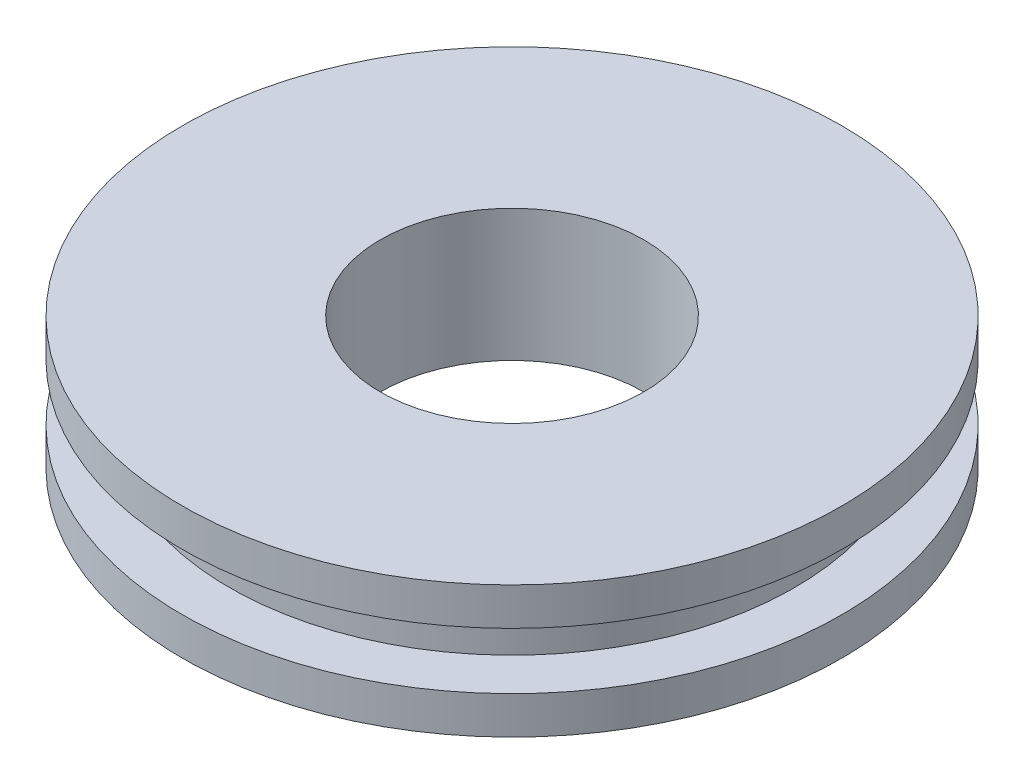
ISO-10303-21;
HEADER;
FILE_DESCRIPTION(('STEP AP214'),'2;1');
FILE_NAME('part.step','',(''),(''),'','','');
FILE_SCHEMA(('AUTOMOTIVE_DESIGN { 1 0 10303 214 1 1 1 1 }'));
ENDSEC;
DATA;
#1=APPLICATION_CONTEXT('core data for automotive mechanical design processes');
#2=APPLICATION_PROTOCOL_DEFINITION('international standard','automotive_design',2000,#1);
#3=PRODUCT_CONTEXT('',#1,'mechanical');
#4=PRODUCT('Part','Part','',(#3));
#5=PRODUCT_RELATED_PRODUCT_CATEGORY('part','',(#4));
#6=PRODUCT_DEFINITION_FORMATION('','',#4);
#7=PRODUCT_DEFINITION_CONTEXT('part definition',#1,'design');
#8=PRODUCT_DEFINITION('design','',#6,#7);
#9=PRODUCT_DEFINITION_SHAPE('','',#8);
#10=(LENGTH_UNIT() NAMED_UNIT(*) SI_UNIT(.MILLI.,.METRE.));
#11=(NAMED_UNIT(*) PLANE_ANGLE_UNIT() SI_UNIT($,.RADIAN.));
#12=(NAMED_UNIT(*) SI_UNIT($,.STERADIAN.) SOLID_ANGLE_UNIT());
#13=UNCERTAINTY_MEASURE_WITH_UNIT(LENGTH_MEASURE(1.E-05),#10,'distance_accuracy_value','');
#14=(GEOMETRIC_REPRESENTATION_CONTEXT(3) GLOBAL_UNCERTAINTY_ASSIGNED_CONTEXT((#13)) GLOBAL_UNIT_ASSIGNED_CONTEXT((#10,
#11,#12)) REPRESENTATION_CONTEXT('',''));
#15=CARTESIAN_POINT('',(0.,0.,0.));
#16=DIRECTION('',(0.,0.,1.));
#17=DIRECTION('',(1.,0.,0.));
#18=AXIS2_PLACEMENT_3D('',#15,#16,#17);
#19=CARTESIAN_POINT('',(0.,0.,0.));
#20=DIRECTION('',(0.,-1.,0.));
#21=DIRECTION('',(0.,0.,-1.));
#22=AXIS2_PLACEMENT_3D('',#19,#20,#21);
#23=CYLINDRICAL_SURFACE('',#22,17.5);
#24=CARTESIAN_POINT('',(0.,3.5,0.));
#25=DIRECTION('',(0.,-1.,0.));
#26=DIRECTION('',(0.,0.,-1.));
#27=AXIS2_PLACEMENT_3D('',#24,#25,#26);
#28=CIRCLE('',#27,17.5);
#29=CARTESIAN_POINT('',(0.,3.5,-17.5));
#30=VERTEX_POINT('',#29);
#31=EDGE_CURVE('E59',#30,#30,#28,.T.);
#32=ORIENTED_EDGE('',*,*,#31,.T.);
#33=EDGE_LOOP('',(#32));
#34=FACE_BOUND('',#33,.T.);
#35=CARTESIAN_POINT('',(0.,1.5,0.));
#36=DIRECTION('',(0.,-1.,0.));
#37=DIRECTION('',(0.,0.,-1.));
#38=AXIS2_PLACEMENT_3D('',#35,#36,#37);
#39=CIRCLE('',#38,17.5);
#40=CARTESIAN_POINT('',(0.,1.5,-17.5));
#41=VERTEX_POINT('',#40);
#42=EDGE_CURVE('E10',#41,#41,#39,.T.);
#43=ORIENTED_EDGE('',*,*,#42,.F.);
#44=EDGE_LOOP('',(#43));
#45=FACE_BOUND('',#44,.T.);
#46=ADVANCED_FACE('F31',(#34,#45),#23,.T.);
#47=CARTESIAN_POINT('',(17.5,1.5,0.));
#48=DIRECTION('',(0.,-1.,0.));
#49=DIRECTION('',(0.,0.,-1.));
#50=AXIS2_PLACEMENT_3D('',#47,#48,#49);
#51=PLANE('',#50);
#52=ORIENTED_EDGE('',*,*,#42,.T.);
#53=EDGE_LOOP('',(#52));
#54=FACE_BOUND('',#53,.T.);
#55=CARTESIAN_POINT('',(0.,1.5,0.));
#56=DIRECTION('',(0.,-1.,0.));
#57=DIRECTION('',(0.,0.,-1.));
#58=AXIS2_PLACEMENT_3D('',#55,#56,#57);
#59=CIRCLE('',#58,15.);
#60=CARTESIAN_POINT('',(0.,1.5,-15.));
#61=VERTEX_POINT('',#60);
#62=EDGE_CURVE('E37',#61,#61,#59,.T.);
#63=ORIENTED_EDGE('',*,*,#62,.F.);
#64=EDGE_LOOP('',(#63));
#65=FACE_BOUND('',#64,.T.);
#66=ADVANCED_FACE('F77',(#54,#65),#51,.T.);
#67=CARTESIAN_POINT('',(0.,0.,0.));
#68=DIRECTION('',(0.,-1.,0.));
#69=DIRECTION('',(0.,0.,-1.));
#70=AXIS2_PLACEMENT_3D('',#67,#68,#69);
#71=CYLINDRICAL_SURFACE('',#70,15.);
#72=ORIENTED_EDGE('',*,*,#62,.T.);
#73=EDGE_LOOP('',(#72));
#74=FACE_BOUND('',#73,.T.);
#75=CARTESIAN_POINT('',(0.,-1.5,0.));
#76=DIRECTION('',(0.,-1.,0.));
#77=DIRECTION('',(0.,0.,-1.));
#78=AXIS2_PLACEMENT_3D('',#75,#76,#77);
#79=CIRCLE('',#78,15.);
#80=CARTESIAN_POINT('',(0.,-1.5,-15.));
#81=VERTEX_POINT('',#80);
#82=EDGE_CURVE('E41',#81,#81,#79,.T.);
#83=ORIENTED_EDGE('',*,*,#82,.F.);
#84=EDGE_LOOP('',(#83));
#85=FACE_BOUND('',#84,.T.);
#86=ADVANCED_FACE('F81',(#74,#85),#71,.T.);
#87=CARTESIAN_POINT('',(17.5,-1.5,0.));
#88=DIRECTION('',(0.,1.,0.));
#89=DIRECTION('',(0.,0.,1.));
#90=AXIS2_PLACEMENT_3D('',#87,#88,#89);
#91=PLANE('',#90);
#92=ORIENTED_EDGE('',*,*,#82,.T.);
#93=EDGE_LOOP('',(#92));
#94=FACE_BOUND('',#93,.T.);
#95=CARTESIAN_POINT('',(0.,-1.5,0.));
#96=DIRECTION('',(0.,-1.,0.));
#97=DIRECTION('',(0.,0.,-1.));
#98=AXIS2_PLACEMENT_3D('',#95,#96,#97);
#99=CIRCLE('',#98,17.5);
#100=CARTESIAN_POINT('',(0.,-1.5,-17.5));
#101=VERTEX_POINT('',#100);
#102=EDGE_CURVE('E45',#101,#101,#99,.T.);
#103=ORIENTED_EDGE('',*,*,#102,.F.);
#104=EDGE_LOOP('',(#103));
#105=FACE_BOUND('',#104,.T.);
#106=ADVANCED_FACE('F85',(#94,#105),#91,.T.);
#107=CARTESIAN_POINT('',(0.,0.,0.));
#108=DIRECTION('',(0.,-1.,0.));
#109=DIRECTION('',(0.,0.,-1.));
#110=AXIS2_PLACEMENT_3D('',#107,#108,#109);
#111=CYLINDRICAL_SURFACE('',#110,17.5);
#112=ORIENTED_EDGE('',*,*,#102,.T.);
#113=EDGE_LOOP('',(#112));
#114=FACE_BOUND('',#113,.T.);
#115=CARTESIAN_POINT('',(0.,-3.5,0.));
#116=DIRECTION('',(0.,-1.,0.));
#117=DIRECTION('',(0.,0.,-1.));
#118=AXIS2_PLACEMENT_3D('',#115,#116,#117);
#119=CIRCLE('',#118,17.5);
#120=CARTESIAN_POINT('',(0.,-3.5,-17.5));
#121=VERTEX_POINT('',#120);
#122=EDGE_CURVE('E50',#121,#121,#119,.T.);
#123=ORIENTED_EDGE('',*,*,#122,.F.);
#124=EDGE_LOOP('',(#123));
#125=FACE_BOUND('',#124,.T.);
#126=ADVANCED_FACE('F91',(#114,#125),#111,.T.);
#127=CARTESIAN_POINT('',(7.,-3.5,0.));
#128=DIRECTION('',(0.,-1.,0.));
#129=DIRECTION('',(0.,0.,-1.));
#130=AXIS2_PLACEMENT_3D('',#127,#128,#129);
#131=PLANE('',#130);
#132=ORIENTED_EDGE('',*,*,#122,.T.);
#133=EDGE_LOOP('',(#132));
#134=FACE_BOUND('',#133,.T.);
#135=CARTESIAN_POINT('',(0.,-3.5,0.));
#136=DIRECTION('',(0.,-1.,0.));
#137=DIRECTION('',(0.,0.,-1.));
#138=AXIS2_PLACEMENT_3D('',#135,#136,#137);
#139=CIRCLE('',#138,7.);
#140=CARTESIAN_POINT('',(0.,-3.5,-7.));
#141=VERTEX_POINT('',#140);
#142=EDGE_CURVE('E53',#141,#141,#139,.T.);
#143=ORIENTED_EDGE('',*,*,#142,.F.);
#144=EDGE_LOOP('',(#143));
#145=FACE_BOUND('',#144,.T.);
#146=ADVANCED_FACE('F73',(#134,#145),#131,.T.);
#147=CARTESIAN_POINT('',(0.,0.,0.));
#148=DIRECTION('',(0.,-1.,0.));
#149=DIRECTION('',(0.,0.,-1.));
#150=AXIS2_PLACEMENT_3D('',#147,#148,#149);
#151=CYLINDRICAL_SURFACE('',#150,7.);
#152=ORIENTED_EDGE('',*,*,#142,.T.);
#153=EDGE_LOOP('',(#152));
#154=FACE_BOUND('',#153,.T.);
#155=CARTESIAN_POINT('',(0.,3.5,0.));
#156=DIRECTION('',(0.,-1.,0.));
#157=DIRECTION('',(0.,0.,-1.));
#158=AXIS2_PLACEMENT_3D('',#155,#156,#157);
#159=CIRCLE('',#158,7.);
#160=CARTESIAN_POINT('',(0.,3.5,-7.));
#161=VERTEX_POINT('',#160);
#162=EDGE_CURVE('E56',#161,#161,#159,.T.);
#163=ORIENTED_EDGE('',*,*,#162,.F.);
#164=EDGE_LOOP('',(#163));
#165=FACE_BOUND('',#164,.T.);
#166=ADVANCED_FACE('F67',(#154,#165),#151,.F.);
#167=CARTESIAN_POINT('',(7.,3.5,0.));
#168=DIRECTION('',(0.,1.,0.));
#169=DIRECTION('',(0.,0.,1.));
#170=AXIS2_PLACEMENT_3D('',#167,#168,#169);
#171=PLANE('',#170);
#172=ORIENTED_EDGE('',*,*,#162,.T.);
#173=EDGE_LOOP('',(#172));
#174=FACE_BOUND('',#173,.T.);
#175=ORIENTED_EDGE('',*,*,#31,.F.);
#176=EDGE_LOOP('',(#175));
#177=FACE_BOUND('',#176,.T.);
#178=ADVANCED_FACE('F65',(#174,#177),#171,.T.);
#179=CLOSED_SHELL('',(#46,#66,#86,#106,#126,#146,#166,#178));
#180=MANIFOLD_SOLID_BREP('B2',#179);
#181=ADVANCED_BREP_SHAPE_REPRESENTATION('',(#18,#180),#14);
#182=SHAPE_DEFINITION_REPRESENTATION(#9,#181);
ENDSEC;
END-ISO-10303-21;
